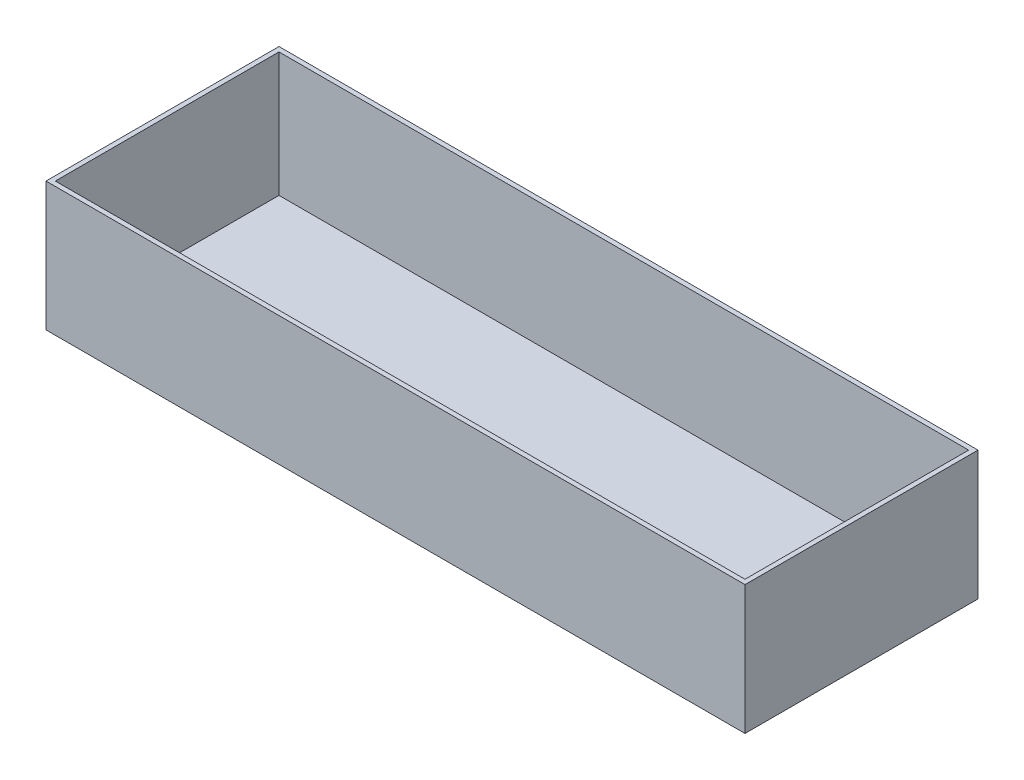
ISO-10303-21;
HEADER;
FILE_DESCRIPTION(('STEP AP214'),'2;1');
FILE_NAME('part.step','',(''),(''),'','','');
FILE_SCHEMA(('AUTOMOTIVE_DESIGN { 1 0 10303 214 1 1 1 1 }'));
ENDSEC;
DATA;
#1=APPLICATION_CONTEXT('core data for automotive mechanical design processes');
#2=APPLICATION_PROTOCOL_DEFINITION('international standard','automotive_design',2000,#1);
#3=PRODUCT_CONTEXT('',#1,'mechanical');
#4=PRODUCT('Part','Part','',(#3));
#5=PRODUCT_RELATED_PRODUCT_CATEGORY('part','',(#4));
#6=PRODUCT_DEFINITION_FORMATION('','',#4);
#7=PRODUCT_DEFINITION_CONTEXT('part definition',#1,'design');
#8=PRODUCT_DEFINITION('design','',#6,#7);
#9=PRODUCT_DEFINITION_SHAPE('','',#8);
#10=(LENGTH_UNIT() NAMED_UNIT(*) SI_UNIT(.MILLI.,.METRE.));
#11=(NAMED_UNIT(*) PLANE_ANGLE_UNIT() SI_UNIT($,.RADIAN.));
#12=(NAMED_UNIT(*) SI_UNIT($,.STERADIAN.) SOLID_ANGLE_UNIT());
#13=UNCERTAINTY_MEASURE_WITH_UNIT(LENGTH_MEASURE(1.E-05),#10,'distance_accuracy_value','');
#14=(GEOMETRIC_REPRESENTATION_CONTEXT(3) GLOBAL_UNCERTAINTY_ASSIGNED_CONTEXT((#13)) GLOBAL_UNIT_ASSIGNED_CONTEXT((#10,
#11,#12)) REPRESENTATION_CONTEXT('',''));
#15=CARTESIAN_POINT('',(0.,0.,0.));
#16=DIRECTION('',(0.,0.,1.));
#17=DIRECTION('',(1.,0.,0.));
#18=AXIS2_PLACEMENT_3D('',#15,#16,#17);
#19=CARTESIAN_POINT('',(0.,1.2,0.));
#20=DIRECTION('',(0.,-1.,0.));
#21=DIRECTION('',(0.,0.,-1.));
#22=AXIS2_PLACEMENT_3D('',#19,#20,#21);
#23=PLANE('',#22);
#24=DIRECTION('',(0.,0.,-1.));
#25=VECTOR('',#24,1.);
#26=CARTESIAN_POINT('',(178.8,1.2,-58.8));
#27=LINE('',#26,#25);
#28=CARTESIAN_POINT('',(178.8,1.2,-1.2));
#29=VERTEX_POINT('',#28);
#30=CARTESIAN_POINT('',(178.8,1.2,-58.8));
#31=VERTEX_POINT('',#30);
#32=EDGE_CURVE('E155',#29,#31,#27,.T.);
#33=ORIENTED_EDGE('',*,*,#32,.T.);
#34=DIRECTION('',(-1.,0.,0.));
#35=VECTOR('',#34,1.);
#36=CARTESIAN_POINT('',(1.2,1.2,-58.8));
#37=LINE('',#36,#35);
#38=CARTESIAN_POINT('',(1.2,1.2,-58.8));
#39=VERTEX_POINT('',#38);
#40=EDGE_CURVE('E143',#31,#39,#37,.T.);
#41=ORIENTED_EDGE('',*,*,#40,.T.);
#42=DIRECTION('',(0.,0.,1.));
#43=VECTOR('',#42,1.);
#44=CARTESIAN_POINT('',(1.2,1.2,-58.8));
#45=LINE('',#44,#43);
#46=CARTESIAN_POINT('',(1.2,1.2,-1.2));
#47=VERTEX_POINT('',#46);
#48=EDGE_CURVE('E146',#39,#47,#45,.T.);
#49=ORIENTED_EDGE('',*,*,#48,.T.);
#50=DIRECTION('',(1.,0.,0.));
#51=VECTOR('',#50,1.);
#52=CARTESIAN_POINT('',(1.2,1.2,-1.2));
#53=LINE('',#52,#51);
#54=EDGE_CURVE('E165',#47,#29,#53,.T.);
#55=ORIENTED_EDGE('',*,*,#54,.T.);
#56=EDGE_LOOP('',(#33,#41,#49,#55));
#57=FACE_BOUND('',#56,.T.);
#58=DIRECTION('',(0.,0.,1.));
#59=VECTOR('',#58,1.);
#60=CARTESIAN_POINT('',(16.2,1.2,-8.3));
#61=LINE('',#60,#59);
#62=CARTESIAN_POINT('',(16.2,1.2,-8.3));
#63=VERTEX_POINT('',#62);
#64=CARTESIAN_POINT('',(16.2,1.2,-7.49999999999999));
#65=VERTEX_POINT('',#64);
#66=EDGE_CURVE('E142',#63,#65,#61,.T.);
#67=ORIENTED_EDGE('',*,*,#66,.F.);
#68=DIRECTION('',(-1.,0.,0.));
#69=VECTOR('',#68,1.);
#70=CARTESIAN_POINT('',(16.2,1.2,-8.3));
#71=LINE('',#70,#69);
#72=CARTESIAN_POINT('',(56.2,1.2,-8.3));
#73=VERTEX_POINT('',#72);
#74=EDGE_CURVE('E139',#73,#63,#71,.T.);
#75=ORIENTED_EDGE('',*,*,#74,.F.);
#76=DIRECTION('',(0.,0.,-1.));
#77=VECTOR('',#76,1.);
#78=CARTESIAN_POINT('',(56.2,1.2,-8.3));
#79=LINE('',#78,#77);
#80=CARTESIAN_POINT('',(56.2,1.2,-7.49999999999999));
#81=VERTEX_POINT('',#80);
#82=EDGE_CURVE('E53',#81,#73,#79,.T.);
#83=ORIENTED_EDGE('',*,*,#82,.F.);
#84=DIRECTION('',(1.,0.,0.));
#85=VECTOR('',#84,1.);
#86=CARTESIAN_POINT('',(16.2,1.2,-7.49999999999999));
#87=LINE('',#86,#85);
#88=EDGE_CURVE('E48',#65,#81,#87,.T.);
#89=ORIENTED_EDGE('',*,*,#88,.F.);
#90=EDGE_LOOP('',(#67,#75,#83,#89));
#91=FACE_BOUND('',#90,.T.);
#92=ADVANCED_FACE('F33',(#57,#91),#23,.F.);
#93=CARTESIAN_POINT('',(0.,1.2,0.));
#94=DIRECTION('',(1.,0.,0.));
#95=DIRECTION('',(0.,0.,-1.));
#96=AXIS2_PLACEMENT_3D('',#93,#94,#95);
#97=PLANE('',#96);
#98=DIRECTION('',(0.,0.,1.));
#99=VECTOR('',#98,1.);
#100=CARTESIAN_POINT('',(0.,0.,0.));
#101=LINE('',#100,#99);
#102=CARTESIAN_POINT('',(0.,0.,-60.));
#103=VERTEX_POINT('',#102);
#104=CARTESIAN_POINT('',(0.,0.,0.));
#105=VERTEX_POINT('',#104);
#106=EDGE_CURVE('E190',#103,#105,#101,.T.);
#107=ORIENTED_EDGE('',*,*,#106,.T.);
#108=DIRECTION('',(0.,-1.,0.));
#109=VECTOR('',#108,1.);
#110=CARTESIAN_POINT('',(0.,1.2,0.));
#111=LINE('',#110,#109);
#112=CARTESIAN_POINT('',(0.,33.2,0.));
#113=VERTEX_POINT('',#112);
#114=EDGE_CURVE('E11',#113,#105,#111,.T.);
#115=ORIENTED_EDGE('',*,*,#114,.F.);
#116=DIRECTION('',(0.,0.,1.));
#117=VECTOR('',#116,1.);
#118=CARTESIAN_POINT('',(0.,33.2,-60.));
#119=LINE('',#118,#117);
#120=CARTESIAN_POINT('',(0.,33.2,-60.));
#121=VERTEX_POINT('',#120);
#122=EDGE_CURVE('E178',#121,#113,#119,.T.);
#123=ORIENTED_EDGE('',*,*,#122,.F.);
#124=DIRECTION('',(0.,-1.,0.));
#125=VECTOR('',#124,1.);
#126=CARTESIAN_POINT('',(0.,1.2,-60.));
#127=LINE('',#126,#125);
#128=EDGE_CURVE('E199',#121,#103,#127,.T.);
#129=ORIENTED_EDGE('',*,*,#128,.T.);
#130=EDGE_LOOP('',(#107,#115,#123,#129));
#131=FACE_BOUND('',#130,.T.);
#132=ADVANCED_FACE('F35',(#131),#97,.F.);
#133=CARTESIAN_POINT('',(0.,1.2,0.));
#134=DIRECTION('',(0.,0.,-1.));
#135=DIRECTION('',(-1.,0.,0.));
#136=AXIS2_PLACEMENT_3D('',#133,#134,#135);
#137=PLANE('',#136);
#138=DIRECTION('',(1.,0.,0.));
#139=VECTOR('',#138,1.);
#140=CARTESIAN_POINT('',(0.,0.,0.));
#141=LINE('',#140,#139);
#142=CARTESIAN_POINT('',(180.,0.,0.));
#143=VERTEX_POINT('',#142);
#144=EDGE_CURVE('E193',#105,#143,#141,.T.);
#145=ORIENTED_EDGE('',*,*,#144,.T.);
#146=DIRECTION('',(0.,-1.,0.));
#147=VECTOR('',#146,1.);
#148=CARTESIAN_POINT('',(180.,1.2,0.));
#149=LINE('',#148,#147);
#150=CARTESIAN_POINT('',(180.,33.2,0.));
#151=VERTEX_POINT('',#150);
#152=EDGE_CURVE('E41',#151,#143,#149,.T.);
#153=ORIENTED_EDGE('',*,*,#152,.F.);
#154=DIRECTION('',(1.,0.,0.));
#155=VECTOR('',#154,1.);
#156=CARTESIAN_POINT('',(0.,33.2,0.));
#157=LINE('',#156,#155);
#158=EDGE_CURVE('E181',#113,#151,#157,.T.);
#159=ORIENTED_EDGE('',*,*,#158,.F.);
#160=ORIENTED_EDGE('',*,*,#114,.T.);
#161=EDGE_LOOP('',(#145,#153,#159,#160));
#162=FACE_BOUND('',#161,.T.);
#163=ADVANCED_FACE('F223',(#162),#137,.F.);
#164=CARTESIAN_POINT('',(180.,1.2,0.));
#165=DIRECTION('',(-1.,0.,0.));
#166=DIRECTION('',(0.,0.,1.));
#167=AXIS2_PLACEMENT_3D('',#164,#165,#166);
#168=PLANE('',#167);
#169=DIRECTION('',(0.,0.,-1.));
#170=VECTOR('',#169,1.);
#171=CARTESIAN_POINT('',(180.,0.,0.));
#172=LINE('',#171,#170);
#173=CARTESIAN_POINT('',(180.,0.,-60.));
#174=VERTEX_POINT('',#173);
#175=EDGE_CURVE('E195',#143,#174,#172,.T.);
#176=ORIENTED_EDGE('',*,*,#175,.T.);
#177=DIRECTION('',(0.,-1.,0.));
#178=VECTOR('',#177,1.);
#179=CARTESIAN_POINT('',(180.,1.2,-60.));
#180=LINE('',#179,#178);
#181=CARTESIAN_POINT('',(180.,33.2,-60.));
#182=VERTEX_POINT('',#181);
#183=EDGE_CURVE('E202',#182,#174,#180,.T.);
#184=ORIENTED_EDGE('',*,*,#183,.F.);
#185=DIRECTION('',(0.,0.,-1.));
#186=VECTOR('',#185,1.);
#187=CARTESIAN_POINT('',(180.,33.2,-60.));
#188=LINE('',#187,#186);
#189=EDGE_CURVE('E184',#151,#182,#188,.T.);
#190=ORIENTED_EDGE('',*,*,#189,.F.);
#191=ORIENTED_EDGE('',*,*,#152,.T.);
#192=EDGE_LOOP('',(#176,#184,#190,#191));
#193=FACE_BOUND('',#192,.T.);
#194=ADVANCED_FACE('F208',(#193),#168,.F.);
#195=CARTESIAN_POINT('',(0.,1.2,-60.));
#196=DIRECTION('',(0.,0.,1.));
#197=DIRECTION('',(1.,0.,0.));
#198=AXIS2_PLACEMENT_3D('',#195,#196,#197);
#199=PLANE('',#198);
#200=DIRECTION('',(-1.,0.,0.));
#201=VECTOR('',#200,1.);
#202=CARTESIAN_POINT('',(0.,0.,-60.));
#203=LINE('',#202,#201);
#204=EDGE_CURVE('E197',#174,#103,#203,.T.);
#205=ORIENTED_EDGE('',*,*,#204,.T.);
#206=ORIENTED_EDGE('',*,*,#128,.F.);
#207=DIRECTION('',(-1.,0.,0.));
#208=VECTOR('',#207,1.);
#209=CARTESIAN_POINT('',(0.,33.2,-60.));
#210=LINE('',#209,#208);
#211=EDGE_CURVE('E187',#182,#121,#210,.T.);
#212=ORIENTED_EDGE('',*,*,#211,.F.);
#213=ORIENTED_EDGE('',*,*,#183,.T.);
#214=EDGE_LOOP('',(#205,#206,#212,#213));
#215=FACE_BOUND('',#214,.T.);
#216=ADVANCED_FACE('F216',(#215),#199,.F.);
#217=CARTESIAN_POINT('',(0.,0.,0.));
#218=DIRECTION('',(0.,-1.,0.));
#219=DIRECTION('',(0.,0.,-1.));
#220=AXIS2_PLACEMENT_3D('',#217,#218,#219);
#221=PLANE('',#220);
#222=ORIENTED_EDGE('',*,*,#106,.F.);
#223=ORIENTED_EDGE('',*,*,#204,.F.);
#224=ORIENTED_EDGE('',*,*,#175,.F.);
#225=ORIENTED_EDGE('',*,*,#144,.F.);
#226=EDGE_LOOP('',(#222,#223,#224,#225));
#227=FACE_BOUND('',#226,.T.);
#228=ADVANCED_FACE('F214',(#227),#221,.T.);
#229=CARTESIAN_POINT('',(0.,33.2,0.));
#230=DIRECTION('',(0.,1.,0.));
#231=DIRECTION('',(0.,0.,1.));
#232=AXIS2_PLACEMENT_3D('',#229,#230,#231);
#233=PLANE('',#232);
#234=ORIENTED_EDGE('',*,*,#122,.T.);
#235=ORIENTED_EDGE('',*,*,#158,.T.);
#236=ORIENTED_EDGE('',*,*,#189,.T.);
#237=ORIENTED_EDGE('',*,*,#211,.T.);
#238=EDGE_LOOP('',(#234,#235,#236,#237));
#239=FACE_BOUND('',#238,.T.);
#240=DIRECTION('',(0.,0.,1.));
#241=VECTOR('',#240,1.);
#242=CARTESIAN_POINT('',(1.2,33.2,-58.8));
#243=LINE('',#242,#241);
#244=CARTESIAN_POINT('',(1.2,33.2,-58.8));
#245=VERTEX_POINT('',#244);
#246=CARTESIAN_POINT('',(1.2,33.2,-1.2));
#247=VERTEX_POINT('',#246);
#248=EDGE_CURVE('E154',#245,#247,#243,.T.);
#249=ORIENTED_EDGE('',*,*,#248,.F.);
#250=DIRECTION('',(-1.,0.,0.));
#251=VECTOR('',#250,1.);
#252=CARTESIAN_POINT('',(1.2,33.2,-58.8));
#253=LINE('',#252,#251);
#254=CARTESIAN_POINT('',(178.8,33.2,-58.8));
#255=VERTEX_POINT('',#254);
#256=EDGE_CURVE('E152',#255,#245,#253,.T.);
#257=ORIENTED_EDGE('',*,*,#256,.F.);
#258=DIRECTION('',(0.,0.,-1.));
#259=VECTOR('',#258,1.);
#260=CARTESIAN_POINT('',(178.8,33.2,-58.8));
#261=LINE('',#260,#259);
#262=CARTESIAN_POINT('',(178.8,33.2,-1.2));
#263=VERTEX_POINT('',#262);
#264=EDGE_CURVE('E160',#263,#255,#261,.T.);
#265=ORIENTED_EDGE('',*,*,#264,.F.);
#266=DIRECTION('',(1.,0.,0.));
#267=VECTOR('',#266,1.);
#268=CARTESIAN_POINT('',(1.2,33.2,-1.2));
#269=LINE('',#268,#267);
#270=EDGE_CURVE('E157',#247,#263,#269,.T.);
#271=ORIENTED_EDGE('',*,*,#270,.F.);
#272=EDGE_LOOP('',(#249,#257,#265,#271));
#273=FACE_BOUND('',#272,.T.);
#274=ADVANCED_FACE('F221',(#239,#273),#233,.T.);
#275=CARTESIAN_POINT('',(1.2,33.2,-58.8));
#276=DIRECTION('',(0.,0.,1.));
#277=DIRECTION('',(1.,0.,0.));
#278=AXIS2_PLACEMENT_3D('',#275,#276,#277);
#279=PLANE('',#278);
#280=ORIENTED_EDGE('',*,*,#40,.F.);
#281=DIRECTION('',(0.,-1.,0.));
#282=VECTOR('',#281,1.);
#283=CARTESIAN_POINT('',(178.8,33.2,-58.8));
#284=LINE('',#283,#282);
#285=EDGE_CURVE('E161',#255,#31,#284,.T.);
#286=ORIENTED_EDGE('',*,*,#285,.F.);
#287=ORIENTED_EDGE('',*,*,#256,.T.);
#288=DIRECTION('',(0.,-1.,0.));
#289=VECTOR('',#288,1.);
#290=CARTESIAN_POINT('',(1.2,33.2,-58.8));
#291=LINE('',#290,#289);
#292=EDGE_CURVE('E175',#245,#39,#291,.T.);
#293=ORIENTED_EDGE('',*,*,#292,.T.);
#294=EDGE_LOOP('',(#280,#286,#287,#293));
#295=FACE_BOUND('',#294,.T.);
#296=ADVANCED_FACE('F256',(#295),#279,.T.);
#297=CARTESIAN_POINT('',(1.2,33.2,-58.8));
#298=DIRECTION('',(1.,0.,0.));
#299=DIRECTION('',(0.,0.,-1.));
#300=AXIS2_PLACEMENT_3D('',#297,#298,#299);
#301=PLANE('',#300);
#302=ORIENTED_EDGE('',*,*,#48,.F.);
#303=ORIENTED_EDGE('',*,*,#292,.F.);
#304=ORIENTED_EDGE('',*,*,#248,.T.);
#305=DIRECTION('',(0.,-1.,0.));
#306=VECTOR('',#305,1.);
#307=CARTESIAN_POINT('',(1.2,33.2,-1.2));
#308=LINE('',#307,#306);
#309=EDGE_CURVE('E173',#247,#47,#308,.T.);
#310=ORIENTED_EDGE('',*,*,#309,.T.);
#311=EDGE_LOOP('',(#302,#303,#304,#310));
#312=FACE_BOUND('',#311,.T.);
#313=ADVANCED_FACE('F262',(#312),#301,.T.);
#314=CARTESIAN_POINT('',(1.2,33.2,-1.2));
#315=DIRECTION('',(0.,0.,-1.));
#316=DIRECTION('',(-1.,0.,0.));
#317=AXIS2_PLACEMENT_3D('',#314,#315,#316);
#318=PLANE('',#317);
#319=ORIENTED_EDGE('',*,*,#54,.F.);
#320=ORIENTED_EDGE('',*,*,#309,.F.);
#321=ORIENTED_EDGE('',*,*,#270,.T.);
#322=DIRECTION('',(0.,-1.,0.));
#323=VECTOR('',#322,1.);
#324=CARTESIAN_POINT('',(178.8,33.2,-1.2));
#325=LINE('',#324,#323);
#326=EDGE_CURVE('E171',#263,#29,#325,.T.);
#327=ORIENTED_EDGE('',*,*,#326,.T.);
#328=EDGE_LOOP('',(#319,#320,#321,#327));
#329=FACE_BOUND('',#328,.T.);
#330=ADVANCED_FACE('F269',(#329),#318,.T.);
#331=CARTESIAN_POINT('',(178.8,33.2,-58.8));
#332=DIRECTION('',(-1.,0.,0.));
#333=DIRECTION('',(0.,0.,1.));
#334=AXIS2_PLACEMENT_3D('',#331,#332,#333);
#335=PLANE('',#334);
#336=ORIENTED_EDGE('',*,*,#32,.F.);
#337=ORIENTED_EDGE('',*,*,#326,.F.);
#338=ORIENTED_EDGE('',*,*,#264,.T.);
#339=ORIENTED_EDGE('',*,*,#285,.T.);
#340=EDGE_LOOP('',(#336,#337,#338,#339));
#341=FACE_BOUND('',#340,.T.);
#342=ADVANCED_FACE('F277',(#341),#335,.T.);
#343=CARTESIAN_POINT('',(16.2,11.2,-8.3));
#344=DIRECTION('',(1.,0.,0.));
#345=DIRECTION('',(0.,0.,-1.));
#346=AXIS2_PLACEMENT_3D('',#343,#344,#345);
#347=PLANE('',#346);
#348=ORIENTED_EDGE('',*,*,#66,.T.);
#349=DIRECTION('',(0.,-1.,0.));
#350=VECTOR('',#349,1.);
#351=CARTESIAN_POINT('',(16.2,11.2,-7.49999999999999));
#352=LINE('',#351,#350);
#353=CARTESIAN_POINT('',(16.2,11.2,-7.49999999999999));
#354=VERTEX_POINT('',#353);
#355=EDGE_CURVE('E123',#354,#65,#352,.T.);
#356=ORIENTED_EDGE('',*,*,#355,.F.);
#357=DIRECTION('',(0.,0.,1.));
#358=VECTOR('',#357,1.);
#359=CARTESIAN_POINT('',(16.2,11.2,-8.3));
#360=LINE('',#359,#358);
#361=CARTESIAN_POINT('',(16.2,11.2,-8.3));
#362=VERTEX_POINT('',#361);
#363=EDGE_CURVE('E130',#362,#354,#360,.T.);
#364=ORIENTED_EDGE('',*,*,#363,.F.);
#365=DIRECTION('',(0.,-1.,0.));
#366=VECTOR('',#365,1.);
#367=CARTESIAN_POINT('',(16.2,11.2,-8.3));
#368=LINE('',#367,#366);
#369=EDGE_CURVE('E377',#362,#63,#368,.T.);
#370=ORIENTED_EDGE('',*,*,#369,.T.);
#371=EDGE_LOOP('',(#348,#356,#364,#370));
#372=FACE_BOUND('',#371,.T.);
#373=ADVANCED_FACE('F141',(#372),#347,.F.);
#374=CARTESIAN_POINT('',(16.2,11.2,-7.49999999999999));
#375=DIRECTION('',(0.,0.,-1.));
#376=DIRECTION('',(-1.,0.,0.));
#377=AXIS2_PLACEMENT_3D('',#374,#375,#376);
#378=PLANE('',#377);
#379=ORIENTED_EDGE('',*,*,#88,.T.);
#380=DIRECTION('',(0.,-1.,0.));
#381=VECTOR('',#380,1.);
#382=CARTESIAN_POINT('',(56.2,11.2,-7.49999999999999));
#383=LINE('',#382,#381);
#384=CARTESIAN_POINT('',(56.2,11.2,-7.49999999999999));
#385=VERTEX_POINT('',#384);
#386=EDGE_CURVE('E126',#385,#81,#383,.T.);
#387=ORIENTED_EDGE('',*,*,#386,.F.);
#388=DIRECTION('',(1.,0.,0.));
#389=VECTOR('',#388,1.);
#390=CARTESIAN_POINT('',(16.2,11.2,-7.49999999999999));
#391=LINE('',#390,#389);
#392=EDGE_CURVE('E119',#354,#385,#391,.T.);
#393=ORIENTED_EDGE('',*,*,#392,.F.);
#394=ORIENTED_EDGE('',*,*,#355,.T.);
#395=EDGE_LOOP('',(#379,#387,#393,#394));
#396=FACE_BOUND('',#395,.T.);
#397=ADVANCED_FACE('F121',(#396),#378,.F.);
#398=CARTESIAN_POINT('',(56.2,11.2,-8.3));
#399=DIRECTION('',(-1.,0.,0.));
#400=DIRECTION('',(0.,0.,1.));
#401=AXIS2_PLACEMENT_3D('',#398,#399,#400);
#402=PLANE('',#401);
#403=ORIENTED_EDGE('',*,*,#82,.T.);
#404=DIRECTION('',(0.,-1.,0.));
#405=VECTOR('',#404,1.);
#406=CARTESIAN_POINT('',(56.2,11.2,-8.3));
#407=LINE('',#406,#405);
#408=CARTESIAN_POINT('',(56.2,11.2,-8.3));
#409=VERTEX_POINT('',#408);
#410=EDGE_CURVE('E148',#409,#73,#407,.T.);
#411=ORIENTED_EDGE('',*,*,#410,.F.);
#412=DIRECTION('',(0.,0.,-1.));
#413=VECTOR('',#412,1.);
#414=CARTESIAN_POINT('',(56.2,11.2,-8.3));
#415=LINE('',#414,#413);
#416=EDGE_CURVE('E129',#385,#409,#415,.T.);
#417=ORIENTED_EDGE('',*,*,#416,.F.);
#418=ORIENTED_EDGE('',*,*,#386,.T.);
#419=EDGE_LOOP('',(#403,#411,#417,#418));
#420=FACE_BOUND('',#419,.T.);
#421=ADVANCED_FACE('F298',(#420),#402,.F.);
#422=CARTESIAN_POINT('',(16.2,11.2,-8.3));
#423=DIRECTION('',(0.,0.,1.));
#424=DIRECTION('',(1.,0.,0.));
#425=AXIS2_PLACEMENT_3D('',#422,#423,#424);
#426=PLANE('',#425);
#427=ORIENTED_EDGE('',*,*,#74,.T.);
#428=ORIENTED_EDGE('',*,*,#369,.F.);
#429=DIRECTION('',(-1.,0.,0.));
#430=VECTOR('',#429,1.);
#431=CARTESIAN_POINT('',(16.2,11.2,-8.3));
#432=LINE('',#431,#430);
#433=EDGE_CURVE('E135',#409,#362,#432,.T.);
#434=ORIENTED_EDGE('',*,*,#433,.F.);
#435=ORIENTED_EDGE('',*,*,#410,.T.);
#436=EDGE_LOOP('',(#427,#428,#434,#435));
#437=FACE_BOUND('',#436,.T.);
#438=ADVANCED_FACE('F305',(#437),#426,.F.);
#439=CARTESIAN_POINT('',(0.,11.2,0.));
#440=DIRECTION('',(0.,1.,0.));
#441=DIRECTION('',(0.,0.,1.));
#442=AXIS2_PLACEMENT_3D('',#439,#440,#441);
#443=PLANE('',#442);
#444=ORIENTED_EDGE('',*,*,#363,.T.);
#445=ORIENTED_EDGE('',*,*,#392,.T.);
#446=ORIENTED_EDGE('',*,*,#416,.T.);
#447=ORIENTED_EDGE('',*,*,#433,.T.);
#448=EDGE_LOOP('',(#444,#445,#446,#447));
#449=FACE_BOUND('',#448,.T.);
#450=ADVANCED_FACE('F133',(#449),#443,.T.);
#451=CLOSED_SHELL('',(#92,#132,#163,#194,#216,#228,#274,#296,#313,#330,#342,#373,#397,#421,#438,#450));
#452=MANIFOLD_SOLID_BREP('B2',#451);
#453=ADVANCED_BREP_SHAPE_REPRESENTATION('',(#18,#452),#14);
#454=SHAPE_DEFINITION_REPRESENTATION(#9,#453);
ENDSEC;
END-ISO-10303-21;
